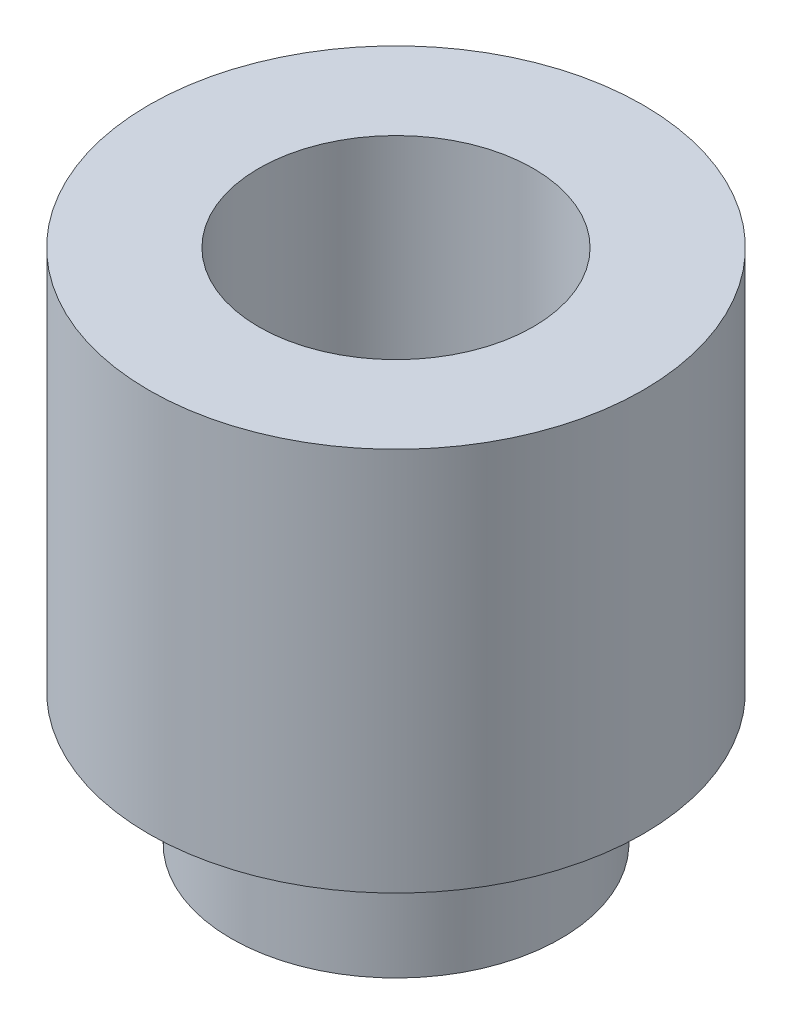
ISO-10303-21;
HEADER;
FILE_DESCRIPTION(('STEP AP214'),'2;1');
FILE_NAME('part.step','',(''),(''),'','','');
FILE_SCHEMA(('AUTOMOTIVE_DESIGN { 1 0 10303 214 1 1 1 1 }'));
ENDSEC;
DATA;
#1=APPLICATION_CONTEXT('core data for automotive mechanical design processes');
#2=APPLICATION_PROTOCOL_DEFINITION('international standard','automotive_design',2000,#1);
#3=PRODUCT_CONTEXT('',#1,'mechanical');
#4=PRODUCT('Part','Part','',(#3));
#5=PRODUCT_RELATED_PRODUCT_CATEGORY('part','',(#4));
#6=PRODUCT_DEFINITION_FORMATION('','',#4);
#7=PRODUCT_DEFINITION_CONTEXT('part definition',#1,'design');
#8=PRODUCT_DEFINITION('design','',#6,#7);
#9=PRODUCT_DEFINITION_SHAPE('','',#8);
#10=(LENGTH_UNIT() NAMED_UNIT(*) SI_UNIT(.MILLI.,.METRE.));
#11=(NAMED_UNIT(*) PLANE_ANGLE_UNIT() SI_UNIT($,.RADIAN.));
#12=(NAMED_UNIT(*) SI_UNIT($,.STERADIAN.) SOLID_ANGLE_UNIT());
#13=UNCERTAINTY_MEASURE_WITH_UNIT(LENGTH_MEASURE(1.E-05),#10,'distance_accuracy_value','');
#14=(GEOMETRIC_REPRESENTATION_CONTEXT(3) GLOBAL_UNCERTAINTY_ASSIGNED_CONTEXT((#13)) GLOBAL_UNIT_ASSIGNED_CONTEXT((#10,
#11,#12)) REPRESENTATION_CONTEXT('',''));
#15=CARTESIAN_POINT('',(0.,0.,0.));
#16=DIRECTION('',(0.,0.,1.));
#17=DIRECTION('',(1.,0.,0.));
#18=AXIS2_PLACEMENT_3D('',#15,#16,#17);
#19=CARTESIAN_POINT('',(0.,0.,0.));
#20=DIRECTION('',(0.,1.,0.));
#21=DIRECTION('',(0.,0.,1.));
#22=AXIS2_PLACEMENT_3D('',#19,#20,#21);
#23=PLANE('',#22);
#24=CARTESIAN_POINT('',(0.,0.,0.));
#25=DIRECTION('',(0.,1.,0.));
#26=DIRECTION('',(0.,0.,1.));
#27=AXIS2_PLACEMENT_3D('',#24,#25,#26);
#28=CIRCLE('',#27,2.25);
#29=CARTESIAN_POINT('',(0.,0.,2.25));
#30=VERTEX_POINT('',#29);
#31=EDGE_CURVE('E48',#30,#30,#28,.T.);
#32=ORIENTED_EDGE('',*,*,#31,.F.);
#33=EDGE_LOOP('',(#32));
#34=FACE_BOUND('',#33,.T.);
#35=CARTESIAN_POINT('',(0.,0.,0.));
#36=DIRECTION('',(0.,1.,0.));
#37=DIRECTION('',(0.,0.,1.));
#38=AXIS2_PLACEMENT_3D('',#35,#36,#37);
#39=CIRCLE('',#38,1.5);
#40=CARTESIAN_POINT('',(0.,0.,1.5));
#41=VERTEX_POINT('',#40);
#42=EDGE_CURVE('E10',#41,#41,#39,.F.);
#43=ORIENTED_EDGE('',*,*,#42,.F.);
#44=EDGE_LOOP('',(#43));
#45=FACE_BOUND('',#44,.T.);
#46=ADVANCED_FACE('F37',(#34,#45),#23,.F.);
#47=CARTESIAN_POINT('',(0.,3.5,0.));
#48=DIRECTION('',(0.,1.,0.));
#49=DIRECTION('',(0.,0.,1.));
#50=AXIS2_PLACEMENT_3D('',#47,#48,#49);
#51=PLANE('',#50);
#52=CARTESIAN_POINT('',(0.,3.5,0.));
#53=DIRECTION('',(0.,1.,0.));
#54=DIRECTION('',(0.,0.,1.));
#55=AXIS2_PLACEMENT_3D('',#52,#53,#54);
#56=CIRCLE('',#55,2.25);
#57=CARTESIAN_POINT('',(0.,3.5,2.25));
#58=VERTEX_POINT('',#57);
#59=EDGE_CURVE('E44',#58,#58,#56,.T.);
#60=ORIENTED_EDGE('',*,*,#59,.T.);
#61=EDGE_LOOP('',(#60));
#62=FACE_BOUND('',#61,.T.);
#63=CARTESIAN_POINT('',(0.,3.5,0.));
#64=DIRECTION('',(0.,1.,0.));
#65=DIRECTION('',(0.,0.,1.));
#66=AXIS2_PLACEMENT_3D('',#63,#64,#65);
#67=CIRCLE('',#66,1.25);
#68=CARTESIAN_POINT('',(0.,3.5,1.25));
#69=VERTEX_POINT('',#68);
#70=EDGE_CURVE('E53',#69,#69,#67,.T.);
#71=ORIENTED_EDGE('',*,*,#70,.F.);
#72=EDGE_LOOP('',(#71));
#73=FACE_BOUND('',#72,.T.);
#74=ADVANCED_FACE('F80',(#62,#73),#51,.T.);
#75=CARTESIAN_POINT('',(0.,3.5,0.));
#76=DIRECTION('',(0.,-1.,0.));
#77=DIRECTION('',(0.,0.,-1.));
#78=AXIS2_PLACEMENT_3D('',#75,#76,#77);
#79=CYLINDRICAL_SURFACE('',#78,2.25);
#80=ORIENTED_EDGE('',*,*,#59,.F.);
#81=EDGE_LOOP('',(#80));
#82=FACE_BOUND('',#81,.T.);
#83=ORIENTED_EDGE('',*,*,#31,.T.);
#84=EDGE_LOOP('',(#83));
#85=FACE_BOUND('',#84,.T.);
#86=ADVANCED_FACE('F39',(#82,#85),#79,.T.);
#87=CARTESIAN_POINT('',(0.,3.5,0.));
#88=DIRECTION('',(0.,-1.,0.));
#89=DIRECTION('',(0.,0.,-1.));
#90=AXIS2_PLACEMENT_3D('',#87,#88,#89);
#91=CYLINDRICAL_SURFACE('',#90,1.25);
#92=ORIENTED_EDGE('',*,*,#70,.T.);
#93=EDGE_LOOP('',(#92));
#94=FACE_BOUND('',#93,.T.);
#95=CARTESIAN_POINT('',(0.,-1.2,0.));
#96=DIRECTION('',(0.,-1.,0.));
#97=DIRECTION('',(0.,0.,-1.));
#98=AXIS2_PLACEMENT_3D('',#95,#96,#97);
#99=CIRCLE('',#98,1.25);
#100=CARTESIAN_POINT('',(0.,-1.2,-1.25));
#101=VERTEX_POINT('',#100);
#102=EDGE_CURVE('E60',#101,#101,#99,.T.);
#103=ORIENTED_EDGE('',*,*,#102,.T.);
#104=EDGE_LOOP('',(#103));
#105=FACE_BOUND('',#104,.T.);
#106=ADVANCED_FACE('F64',(#94,#105),#91,.F.);
#107=CARTESIAN_POINT('',(0.,-1.2,0.));
#108=DIRECTION('',(0.,-1.,0.));
#109=DIRECTION('',(0.,0.,-1.));
#110=AXIS2_PLACEMENT_3D('',#107,#108,#109);
#111=PLANE('',#110);
#112=CARTESIAN_POINT('',(0.,-1.2,0.));
#113=DIRECTION('',(0.,-1.,0.));
#114=DIRECTION('',(0.,0.,-1.));
#115=AXIS2_PLACEMENT_3D('',#112,#113,#114);
#116=CIRCLE('',#115,1.5);
#117=CARTESIAN_POINT('',(0.,-1.2,-1.5));
#118=VERTEX_POINT('',#117);
#119=EDGE_CURVE('E57',#118,#118,#116,.T.);
#120=ORIENTED_EDGE('',*,*,#119,.T.);
#121=EDGE_LOOP('',(#120));
#122=FACE_BOUND('',#121,.T.);
#123=ORIENTED_EDGE('',*,*,#102,.F.);
#124=EDGE_LOOP('',(#123));
#125=FACE_BOUND('',#124,.T.);
#126=ADVANCED_FACE('F66',(#122,#125),#111,.T.);
#127=CARTESIAN_POINT('',(0.,-1.2,0.));
#128=DIRECTION('',(0.,1.,0.));
#129=DIRECTION('',(0.,0.,1.));
#130=AXIS2_PLACEMENT_3D('',#127,#128,#129);
#131=CYLINDRICAL_SURFACE('',#130,1.5);
#132=ORIENTED_EDGE('',*,*,#119,.F.);
#133=EDGE_LOOP('',(#132));
#134=FACE_BOUND('',#133,.T.);
#135=ORIENTED_EDGE('',*,*,#42,.T.);
#136=EDGE_LOOP('',(#135));
#137=FACE_BOUND('',#136,.T.);
#138=ADVANCED_FACE('F68',(#134,#137),#131,.T.);
#139=CLOSED_SHELL('',(#46,#74,#86,#106,#126,#138));
#140=MANIFOLD_SOLID_BREP('B2',#139);
#141=ADVANCED_BREP_SHAPE_REPRESENTATION('',(#18,#140),#14);
#142=SHAPE_DEFINITION_REPRESENTATION(#9,#141);
ENDSEC;
END-ISO-10303-21;
